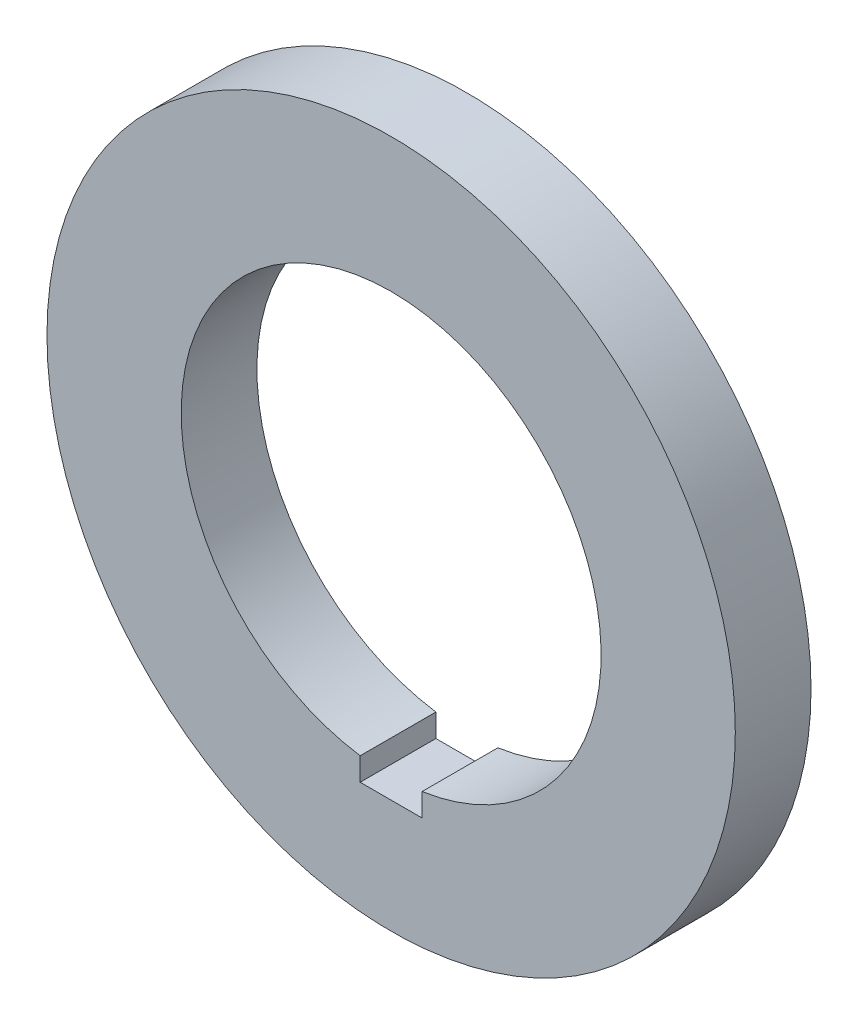
ISO-10303-21;
HEADER;
FILE_DESCRIPTION(('STEP AP214'),'2;1');
FILE_NAME('part.step','',(''),(''),'','','');
FILE_SCHEMA(('AUTOMOTIVE_DESIGN { 1 0 10303 214 1 1 1 1 }'));
ENDSEC;
DATA;
#1=APPLICATION_CONTEXT('core data for automotive mechanical design processes');
#2=APPLICATION_PROTOCOL_DEFINITION('international standard','automotive_design',2000,#1);
#3=PRODUCT_CONTEXT('',#1,'mechanical');
#4=PRODUCT('Part','Part','',(#3));
#5=PRODUCT_RELATED_PRODUCT_CATEGORY('part','',(#4));
#6=PRODUCT_DEFINITION_FORMATION('','',#4);
#7=PRODUCT_DEFINITION_CONTEXT('part definition',#1,'design');
#8=PRODUCT_DEFINITION('design','',#6,#7);
#9=PRODUCT_DEFINITION_SHAPE('','',#8);
#10=(LENGTH_UNIT() NAMED_UNIT(*) SI_UNIT(.MILLI.,.METRE.));
#11=(NAMED_UNIT(*) PLANE_ANGLE_UNIT() SI_UNIT($,.RADIAN.));
#12=(NAMED_UNIT(*) SI_UNIT($,.STERADIAN.) SOLID_ANGLE_UNIT());
#13=UNCERTAINTY_MEASURE_WITH_UNIT(LENGTH_MEASURE(1.E-05),#10,'distance_accuracy_value','');
#14=(GEOMETRIC_REPRESENTATION_CONTEXT(3) GLOBAL_UNCERTAINTY_ASSIGNED_CONTEXT((#13)) GLOBAL_UNIT_ASSIGNED_CONTEXT((#10,
#11,#12)) REPRESENTATION_CONTEXT('',''));
#15=CARTESIAN_POINT('',(0.,0.,0.));
#16=DIRECTION('',(0.,0.,1.));
#17=DIRECTION('',(1.,0.,0.));
#18=AXIS2_PLACEMENT_3D('',#15,#16,#17);
#19=CARTESIAN_POINT('',(0.,0.,5.5));
#20=DIRECTION('',(0.,0.,1.));
#21=DIRECTION('',(1.,0.,0.));
#22=AXIS2_PLACEMENT_3D('',#19,#20,#21);
#23=PLANE('',#22);
#24=DIRECTION('',(0.,1.,0.));
#25=VECTOR('',#24,1.);
#26=CARTESIAN_POINT('',(-2.25,-16.75,5.5));
#27=LINE('',#26,#25);
#28=CARTESIAN_POINT('',(-2.25,-16.75,5.5));
#29=VERTEX_POINT('',#28);
#30=CARTESIAN_POINT('',(-2.25,-15.0831031289984,5.5));
#31=VERTEX_POINT('',#30);
#32=EDGE_CURVE('E90',#29,#31,#27,.T.);
#33=ORIENTED_EDGE('',*,*,#32,.T.);
#34=CARTESIAN_POINT('',(0.,0.,5.5));
#35=DIRECTION('',(0.,0.,1.));
#36=DIRECTION('',(1.,0.,0.));
#37=AXIS2_PLACEMENT_3D('',#34,#35,#36);
#38=CIRCLE('',#37,15.25);
#39=CARTESIAN_POINT('',(2.25,-15.0831031289984,5.5));
#40=VERTEX_POINT('',#39);
#41=EDGE_CURVE('E89',#40,#31,#38,.T.);
#42=ORIENTED_EDGE('',*,*,#41,.F.);
#43=DIRECTION('',(0.,-1.,0.));
#44=VECTOR('',#43,1.);
#45=CARTESIAN_POINT('',(2.25,-16.75,5.5));
#46=LINE('',#45,#44);
#47=CARTESIAN_POINT('',(2.25,-16.75,5.5));
#48=VERTEX_POINT('',#47);
#49=EDGE_CURVE('E48',#40,#48,#46,.T.);
#50=ORIENTED_EDGE('',*,*,#49,.T.);
#51=DIRECTION('',(-1.,0.,0.));
#52=VECTOR('',#51,1.);
#53=CARTESIAN_POINT('',(2.25,-16.75,5.5));
#54=LINE('',#53,#52);
#55=EDGE_CURVE('E80',#48,#29,#54,.T.);
#56=ORIENTED_EDGE('',*,*,#55,.T.);
#57=EDGE_LOOP('',(#33,#42,#50,#56));
#58=FACE_BOUND('',#57,.T.);
#59=CARTESIAN_POINT('',(0.,0.,5.5));
#60=DIRECTION('',(0.,0.,1.));
#61=DIRECTION('',(1.,0.,0.));
#62=AXIS2_PLACEMENT_3D('',#59,#60,#61);
#63=CIRCLE('',#62,25.);
#64=CARTESIAN_POINT('',(25.,0.,5.5));
#65=VERTEX_POINT('',#64);
#66=EDGE_CURVE('E105',#65,#65,#63,.T.);
#67=ORIENTED_EDGE('',*,*,#66,.T.);
#68=EDGE_LOOP('',(#67));
#69=FACE_BOUND('',#68,.T.);
#70=ADVANCED_FACE('F33',(#58,#69),#23,.T.);
#71=CARTESIAN_POINT('',(0.,0.,0.));
#72=DIRECTION('',(0.,0.,1.));
#73=DIRECTION('',(1.,0.,0.));
#74=AXIS2_PLACEMENT_3D('',#71,#72,#73);
#75=PLANE('',#74);
#76=CARTESIAN_POINT('',(0.,0.,0.));
#77=DIRECTION('',(0.,0.,1.));
#78=DIRECTION('',(1.,0.,0.));
#79=AXIS2_PLACEMENT_3D('',#76,#77,#78);
#80=CIRCLE('',#79,25.);
#81=CARTESIAN_POINT('',(25.,0.,0.));
#82=VERTEX_POINT('',#81);
#83=EDGE_CURVE('E102',#82,#82,#80,.T.);
#84=ORIENTED_EDGE('',*,*,#83,.F.);
#85=EDGE_LOOP('',(#84));
#86=FACE_BOUND('',#85,.T.);
#87=CARTESIAN_POINT('',(0.,0.,0.));
#88=DIRECTION('',(0.,0.,1.));
#89=DIRECTION('',(1.,0.,0.));
#90=AXIS2_PLACEMENT_3D('',#87,#88,#89);
#91=CIRCLE('',#90,15.25);
#92=CARTESIAN_POINT('',(2.25,-15.0831031289984,0.));
#93=VERTEX_POINT('',#92);
#94=CARTESIAN_POINT('',(-2.25,-15.0831031289984,0.));
#95=VERTEX_POINT('',#94);
#96=EDGE_CURVE('E99',#93,#95,#91,.T.);
#97=ORIENTED_EDGE('',*,*,#96,.T.);
#98=DIRECTION('',(0.,1.,0.));
#99=VECTOR('',#98,1.);
#100=CARTESIAN_POINT('',(-2.25,-16.75,0.));
#101=LINE('',#100,#99);
#102=CARTESIAN_POINT('',(-2.25,-16.75,0.));
#103=VERTEX_POINT('',#102);
#104=EDGE_CURVE('E95',#103,#95,#101,.T.);
#105=ORIENTED_EDGE('',*,*,#104,.F.);
#106=DIRECTION('',(-1.,0.,0.));
#107=VECTOR('',#106,1.);
#108=CARTESIAN_POINT('',(2.25,-16.75,0.));
#109=LINE('',#108,#107);
#110=CARTESIAN_POINT('',(2.25,-16.75,0.));
#111=VERTEX_POINT('',#110);
#112=EDGE_CURVE('E92',#111,#103,#109,.T.);
#113=ORIENTED_EDGE('',*,*,#112,.F.);
#114=DIRECTION('',(0.,-1.,0.));
#115=VECTOR('',#114,1.);
#116=CARTESIAN_POINT('',(2.25,-16.75,0.));
#117=LINE('',#116,#115);
#118=EDGE_CURVE('E75',#93,#111,#117,.T.);
#119=ORIENTED_EDGE('',*,*,#118,.F.);
#120=EDGE_LOOP('',(#97,#105,#113,#119));
#121=FACE_BOUND('',#120,.T.);
#122=ADVANCED_FACE('F112',(#86,#121),#75,.F.);
#123=CARTESIAN_POINT('',(0.,0.,5.5));
#124=DIRECTION('',(0.,0.,-1.));
#125=DIRECTION('',(-1.,0.,0.));
#126=AXIS2_PLACEMENT_3D('',#123,#124,#125);
#127=CYLINDRICAL_SURFACE('',#126,25.);
#128=ORIENTED_EDGE('',*,*,#66,.F.);
#129=EDGE_LOOP('',(#128));
#130=FACE_BOUND('',#129,.T.);
#131=ORIENTED_EDGE('',*,*,#83,.T.);
#132=EDGE_LOOP('',(#131));
#133=FACE_BOUND('',#132,.T.);
#134=ADVANCED_FACE('F35',(#130,#133),#127,.T.);
#135=CARTESIAN_POINT('',(0.,0.,5.5));
#136=DIRECTION('',(0.,0.,-1.));
#137=DIRECTION('',(-1.,0.,0.));
#138=AXIS2_PLACEMENT_3D('',#135,#136,#137);
#139=CYLINDRICAL_SURFACE('',#138,15.25);
#140=DIRECTION('',(0.,0.,-1.));
#141=VECTOR('',#140,1.);
#142=CARTESIAN_POINT('',(-2.25,-15.0831031289984,5.5));
#143=LINE('',#142,#141);
#144=EDGE_CURVE('E11',#95,#31,#143,.F.);
#145=ORIENTED_EDGE('',*,*,#144,.F.);
#146=ORIENTED_EDGE('',*,*,#96,.F.);
#147=DIRECTION('',(0.,0.,-1.));
#148=VECTOR('',#147,1.);
#149=CARTESIAN_POINT('',(2.25,-15.0831031289984,5.5));
#150=LINE('',#149,#148);
#151=EDGE_CURVE('E41',#40,#93,#150,.T.);
#152=ORIENTED_EDGE('',*,*,#151,.F.);
#153=ORIENTED_EDGE('',*,*,#41,.T.);
#154=EDGE_LOOP('',(#145,#146,#152,#153));
#155=FACE_BOUND('',#154,.T.);
#156=ADVANCED_FACE('F114',(#155),#139,.F.);
#157=CARTESIAN_POINT('',(-2.25,-16.75,5.5));
#158=DIRECTION('',(-1.,0.,0.));
#159=DIRECTION('',(0.,0.,1.));
#160=AXIS2_PLACEMENT_3D('',#157,#158,#159);
#161=PLANE('',#160);
#162=ORIENTED_EDGE('',*,*,#144,.T.);
#163=ORIENTED_EDGE('',*,*,#32,.F.);
#164=DIRECTION('',(0.,0.,-1.));
#165=VECTOR('',#164,1.);
#166=CARTESIAN_POINT('',(-2.25,-16.75,5.5));
#167=LINE('',#166,#165);
#168=EDGE_CURVE('E79',#29,#103,#167,.T.);
#169=ORIENTED_EDGE('',*,*,#168,.T.);
#170=ORIENTED_EDGE('',*,*,#104,.T.);
#171=EDGE_LOOP('',(#162,#163,#169,#170));
#172=FACE_BOUND('',#171,.T.);
#173=ADVANCED_FACE('F116',(#172),#161,.F.);
#174=CARTESIAN_POINT('',(2.25,-16.75,5.5));
#175=DIRECTION('',(0.,-1.,0.));
#176=DIRECTION('',(0.,0.,-1.));
#177=AXIS2_PLACEMENT_3D('',#174,#175,#176);
#178=PLANE('',#177);
#179=ORIENTED_EDGE('',*,*,#112,.T.);
#180=ORIENTED_EDGE('',*,*,#168,.F.);
#181=ORIENTED_EDGE('',*,*,#55,.F.);
#182=DIRECTION('',(0.,0.,-1.));
#183=VECTOR('',#182,1.);
#184=CARTESIAN_POINT('',(2.25,-16.75,5.5));
#185=LINE('',#184,#183);
#186=EDGE_CURVE('E71',#48,#111,#185,.T.);
#187=ORIENTED_EDGE('',*,*,#186,.T.);
#188=EDGE_LOOP('',(#179,#180,#181,#187));
#189=FACE_BOUND('',#188,.T.);
#190=ADVANCED_FACE('F83',(#189),#178,.F.);
#191=CARTESIAN_POINT('',(2.25,-16.75,5.5));
#192=DIRECTION('',(1.,0.,0.));
#193=DIRECTION('',(0.,0.,-1.));
#194=AXIS2_PLACEMENT_3D('',#191,#192,#193);
#195=PLANE('',#194);
#196=ORIENTED_EDGE('',*,*,#151,.T.);
#197=ORIENTED_EDGE('',*,*,#118,.T.);
#198=ORIENTED_EDGE('',*,*,#186,.F.);
#199=ORIENTED_EDGE('',*,*,#49,.F.);
#200=EDGE_LOOP('',(#196,#197,#198,#199));
#201=FACE_BOUND('',#200,.T.);
#202=ADVANCED_FACE('F73',(#201),#195,.F.);
#203=CLOSED_SHELL('',(#70,#122,#134,#156,#173,#190,#202));
#204=MANIFOLD_SOLID_BREP('B2',#203);
#205=ADVANCED_BREP_SHAPE_REPRESENTATION('',(#18,#204),#14);
#206=SHAPE_DEFINITION_REPRESENTATION(#9,#205);
ENDSEC;
END-ISO-10303-21;
